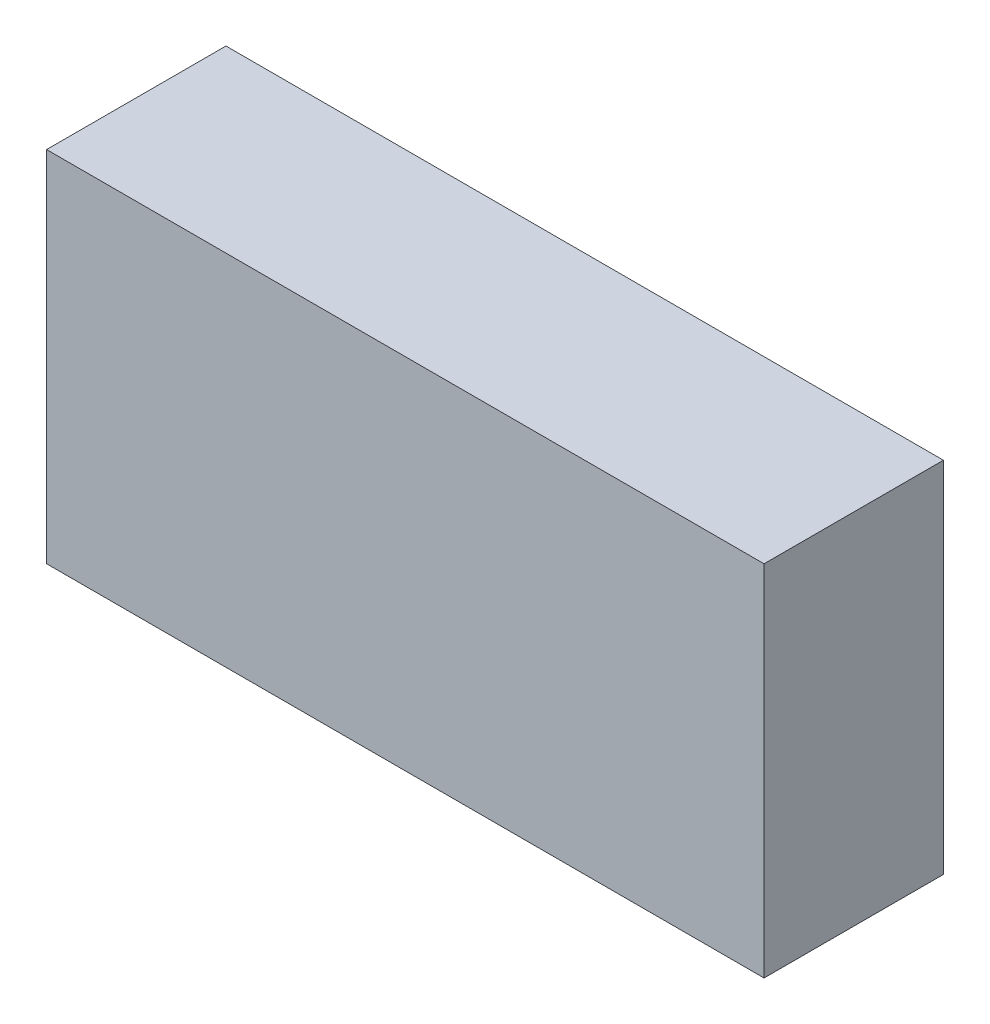
ISO-10303-21;
HEADER;
FILE_DESCRIPTION(('STEP AP214'),'2;1');
FILE_NAME('part.step','',(''),(''),'','','');
FILE_SCHEMA(('AUTOMOTIVE_DESIGN { 1 0 10303 214 1 1 1 1 }'));
ENDSEC;
DATA;
#1=APPLICATION_CONTEXT('core data for automotive mechanical design processes');
#2=APPLICATION_PROTOCOL_DEFINITION('international standard','automotive_design',2000,#1);
#3=PRODUCT_CONTEXT('',#1,'mechanical');
#4=PRODUCT('Part','Part','',(#3));
#5=PRODUCT_RELATED_PRODUCT_CATEGORY('part','',(#4));
#6=PRODUCT_DEFINITION_FORMATION('','',#4);
#7=PRODUCT_DEFINITION_CONTEXT('part definition',#1,'design');
#8=PRODUCT_DEFINITION('design','',#6,#7);
#9=PRODUCT_DEFINITION_SHAPE('','',#8);
#10=(LENGTH_UNIT() NAMED_UNIT(*) SI_UNIT(.MILLI.,.METRE.));
#11=(NAMED_UNIT(*) PLANE_ANGLE_UNIT() SI_UNIT($,.RADIAN.));
#12=(NAMED_UNIT(*) SI_UNIT($,.STERADIAN.) SOLID_ANGLE_UNIT());
#13=UNCERTAINTY_MEASURE_WITH_UNIT(LENGTH_MEASURE(1.E-05),#10,'distance_accuracy_value','');
#14=(GEOMETRIC_REPRESENTATION_CONTEXT(3) GLOBAL_UNCERTAINTY_ASSIGNED_CONTEXT((#13)) GLOBAL_UNIT_ASSIGNED_CONTEXT((#10,
#11,#12)) REPRESENTATION_CONTEXT('',''));
#15=CARTESIAN_POINT('',(0.,0.,0.));
#16=DIRECTION('',(0.,0.,1.));
#17=DIRECTION('',(1.,0.,0.));
#18=AXIS2_PLACEMENT_3D('',#15,#16,#17);
#19=CARTESIAN_POINT('',(0.,20.,10.));
#20=DIRECTION('',(1.,0.,0.));
#21=DIRECTION('',(0.,0.,-1.));
#22=AXIS2_PLACEMENT_3D('',#19,#20,#21);
#23=PLANE('',#22);
#24=DIRECTION('',(0.,-1.,0.));
#25=VECTOR('',#24,1.);
#26=CARTESIAN_POINT('',(0.,20.,0.));
#27=LINE('',#26,#25);
#28=CARTESIAN_POINT('',(0.,20.,0.));
#29=VERTEX_POINT('',#28);
#30=CARTESIAN_POINT('',(0.,0.,0.));
#31=VERTEX_POINT('',#30);
#32=EDGE_CURVE('E104',#29,#31,#27,.T.);
#33=ORIENTED_EDGE('',*,*,#32,.T.);
#34=DIRECTION('',(0.,0.,-1.));
#35=VECTOR('',#34,1.);
#36=CARTESIAN_POINT('',(0.,0.,10.));
#37=LINE('',#36,#35);
#38=CARTESIAN_POINT('',(0.,0.,10.));
#39=VERTEX_POINT('',#38);
#40=EDGE_CURVE('E11',#39,#31,#37,.T.);
#41=ORIENTED_EDGE('',*,*,#40,.F.);
#42=DIRECTION('',(0.,-1.,0.));
#43=VECTOR('',#42,1.);
#44=CARTESIAN_POINT('',(0.,20.,10.));
#45=LINE('',#44,#43);
#46=CARTESIAN_POINT('',(0.,20.,10.));
#47=VERTEX_POINT('',#46);
#48=EDGE_CURVE('E92',#47,#39,#45,.T.);
#49=ORIENTED_EDGE('',*,*,#48,.F.);
#50=DIRECTION('',(0.,0.,-1.));
#51=VECTOR('',#50,1.);
#52=CARTESIAN_POINT('',(0.,20.,10.));
#53=LINE('',#52,#51);
#54=EDGE_CURVE('E100',#47,#29,#53,.T.);
#55=ORIENTED_EDGE('',*,*,#54,.T.);
#56=EDGE_LOOP('',(#33,#41,#49,#55));
#57=FACE_BOUND('',#56,.T.);
#58=ADVANCED_FACE('F41',(#57),#23,.F.);
#59=CARTESIAN_POINT('',(0.,0.,10.));
#60=DIRECTION('',(0.,1.,0.));
#61=DIRECTION('',(0.,0.,1.));
#62=AXIS2_PLACEMENT_3D('',#59,#60,#61);
#63=PLANE('',#62);
#64=DIRECTION('',(1.,0.,0.));
#65=VECTOR('',#64,1.);
#66=CARTESIAN_POINT('',(0.,0.,0.));
#67=LINE('',#66,#65);
#68=CARTESIAN_POINT('',(40.,0.,0.));
#69=VERTEX_POINT('',#68);
#70=EDGE_CURVE('E96',#31,#69,#67,.T.);
#71=ORIENTED_EDGE('',*,*,#70,.T.);
#72=DIRECTION('',(0.,0.,-1.));
#73=VECTOR('',#72,1.);
#74=CARTESIAN_POINT('',(40.,0.,10.));
#75=LINE('',#74,#73);
#76=CARTESIAN_POINT('',(40.,0.,10.));
#77=VERTEX_POINT('',#76);
#78=EDGE_CURVE('E49',#77,#69,#75,.T.);
#79=ORIENTED_EDGE('',*,*,#78,.F.);
#80=DIRECTION('',(1.,0.,0.));
#81=VECTOR('',#80,1.);
#82=CARTESIAN_POINT('',(0.,0.,10.));
#83=LINE('',#82,#81);
#84=EDGE_CURVE('E87',#39,#77,#83,.T.);
#85=ORIENTED_EDGE('',*,*,#84,.F.);
#86=ORIENTED_EDGE('',*,*,#40,.T.);
#87=EDGE_LOOP('',(#71,#79,#85,#86));
#88=FACE_BOUND('',#87,.T.);
#89=ADVANCED_FACE('F95',(#88),#63,.F.);
#90=CARTESIAN_POINT('',(40.,0.,10.));
#91=DIRECTION('',(-1.,0.,0.));
#92=DIRECTION('',(0.,0.,1.));
#93=AXIS2_PLACEMENT_3D('',#90,#91,#92);
#94=PLANE('',#93);
#95=DIRECTION('',(0.,1.,0.));
#96=VECTOR('',#95,1.);
#97=CARTESIAN_POINT('',(40.,0.,0.));
#98=LINE('',#97,#96);
#99=CARTESIAN_POINT('',(40.,20.,0.));
#100=VERTEX_POINT('',#99);
#101=EDGE_CURVE('E74',#69,#100,#98,.T.);
#102=ORIENTED_EDGE('',*,*,#101,.T.);
#103=DIRECTION('',(0.,0.,-1.));
#104=VECTOR('',#103,1.);
#105=CARTESIAN_POINT('',(40.,20.,10.));
#106=LINE('',#105,#104);
#107=CARTESIAN_POINT('',(40.,20.,10.));
#108=VERTEX_POINT('',#107);
#109=EDGE_CURVE('E97',#108,#100,#106,.T.);
#110=ORIENTED_EDGE('',*,*,#109,.F.);
#111=DIRECTION('',(0.,1.,0.));
#112=VECTOR('',#111,1.);
#113=CARTESIAN_POINT('',(40.,0.,10.));
#114=LINE('',#113,#112);
#115=EDGE_CURVE('E90',#77,#108,#114,.T.);
#116=ORIENTED_EDGE('',*,*,#115,.F.);
#117=ORIENTED_EDGE('',*,*,#78,.T.);
#118=EDGE_LOOP('',(#102,#110,#116,#117));
#119=FACE_BOUND('',#118,.T.);
#120=ADVANCED_FACE('F98',(#119),#94,.F.);
#121=CARTESIAN_POINT('',(40.,20.,10.));
#122=DIRECTION('',(0.,-1.,0.));
#123=DIRECTION('',(0.,0.,-1.));
#124=AXIS2_PLACEMENT_3D('',#121,#122,#123);
#125=PLANE('',#124);
#126=DIRECTION('',(-1.,0.,0.));
#127=VECTOR('',#126,1.);
#128=CARTESIAN_POINT('',(40.,20.,0.));
#129=LINE('',#128,#127);
#130=EDGE_CURVE('E80',#100,#29,#129,.T.);
#131=ORIENTED_EDGE('',*,*,#130,.T.);
#132=ORIENTED_EDGE('',*,*,#54,.F.);
#133=DIRECTION('',(-1.,0.,0.));
#134=VECTOR('',#133,1.);
#135=CARTESIAN_POINT('',(40.,20.,10.));
#136=LINE('',#135,#134);
#137=EDGE_CURVE('E57',#108,#47,#136,.T.);
#138=ORIENTED_EDGE('',*,*,#137,.F.);
#139=ORIENTED_EDGE('',*,*,#109,.T.);
#140=EDGE_LOOP('',(#131,#132,#138,#139));
#141=FACE_BOUND('',#140,.T.);
#142=ADVANCED_FACE('F111',(#141),#125,.F.);
#143=CARTESIAN_POINT('',(0.,0.,10.));
#144=DIRECTION('',(0.,0.,1.));
#145=DIRECTION('',(1.,0.,0.));
#146=AXIS2_PLACEMENT_3D('',#143,#144,#145);
#147=PLANE('',#146);
#148=ORIENTED_EDGE('',*,*,#48,.T.);
#149=ORIENTED_EDGE('',*,*,#84,.T.);
#150=ORIENTED_EDGE('',*,*,#115,.T.);
#151=ORIENTED_EDGE('',*,*,#137,.T.);
#152=EDGE_LOOP('',(#148,#149,#150,#151));
#153=FACE_BOUND('',#152,.T.);
#154=ADVANCED_FACE('F88',(#153),#147,.T.);
#155=CARTESIAN_POINT('',(0.,0.,0.));
#156=DIRECTION('',(0.,0.,1.));
#157=DIRECTION('',(1.,0.,0.));
#158=AXIS2_PLACEMENT_3D('',#155,#156,#157);
#159=PLANE('',#158);
#160=ORIENTED_EDGE('',*,*,#32,.F.);
#161=ORIENTED_EDGE('',*,*,#130,.F.);
#162=ORIENTED_EDGE('',*,*,#101,.F.);
#163=ORIENTED_EDGE('',*,*,#70,.F.);
#164=EDGE_LOOP('',(#160,#161,#162,#163));
#165=FACE_BOUND('',#164,.T.);
#166=ADVANCED_FACE('F114',(#165),#159,.F.);
#167=CLOSED_SHELL('',(#58,#89,#120,#142,#154,#166));
#168=MANIFOLD_SOLID_BREP('B2',#167);
#169=ADVANCED_BREP_SHAPE_REPRESENTATION('',(#18,#168),#14);
#170=SHAPE_DEFINITION_REPRESENTATION(#9,#169);
ENDSEC;
END-ISO-10303-21;
